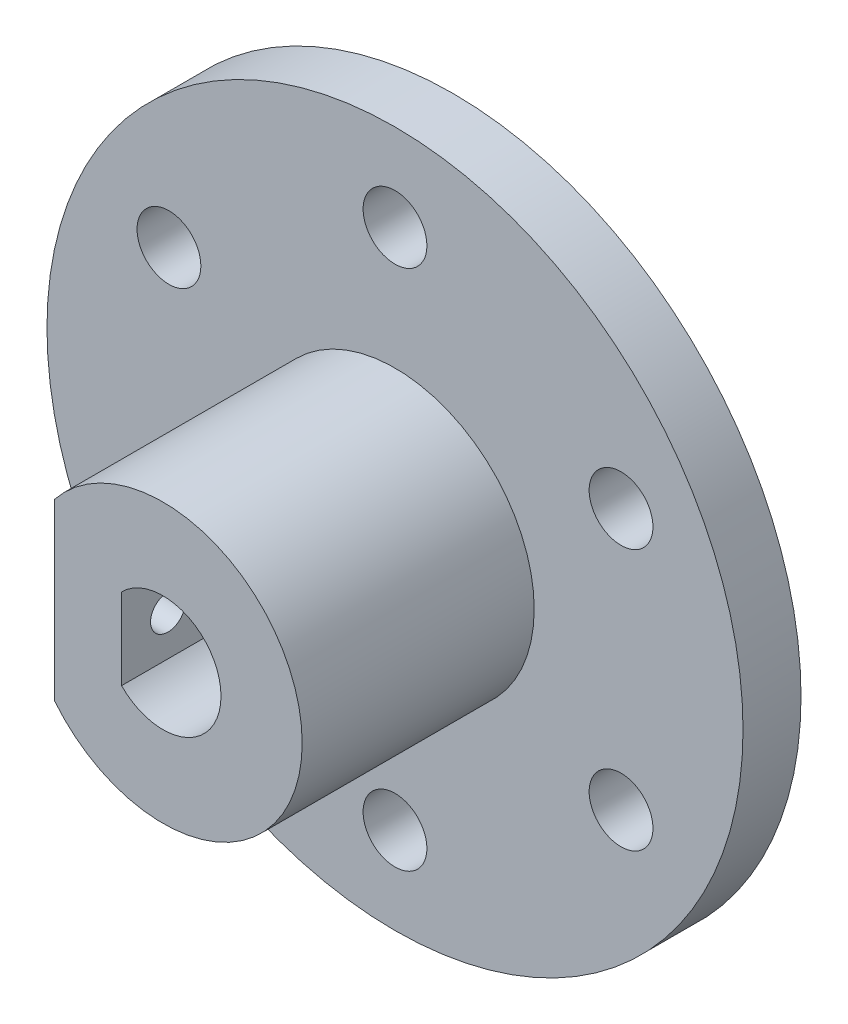
ISO-10303-21;
HEADER;
FILE_DESCRIPTION(('STEP AP214'),'2;1');
FILE_NAME('part.step','',(''),(''),'','','');
FILE_SCHEMA(('AUTOMOTIVE_DESIGN { 1 0 10303 214 1 1 1 1 }'));
ENDSEC;
DATA;
#1=APPLICATION_CONTEXT('core data for automotive mechanical design processes');
#2=APPLICATION_PROTOCOL_DEFINITION('international standard','automotive_design',2000,#1);
#3=PRODUCT_CONTEXT('',#1,'mechanical');
#4=PRODUCT('Part','Part','',(#3));
#5=PRODUCT_RELATED_PRODUCT_CATEGORY('part','',(#4));
#6=PRODUCT_DEFINITION_FORMATION('','',#4);
#7=PRODUCT_DEFINITION_CONTEXT('part definition',#1,'design');
#8=PRODUCT_DEFINITION('design','',#6,#7);
#9=PRODUCT_DEFINITION_SHAPE('','',#8);
#10=(LENGTH_UNIT() NAMED_UNIT(*) SI_UNIT(.MILLI.,.METRE.));
#11=(NAMED_UNIT(*) PLANE_ANGLE_UNIT() SI_UNIT($,.RADIAN.));
#12=(NAMED_UNIT(*) SI_UNIT($,.STERADIAN.) SOLID_ANGLE_UNIT());
#13=UNCERTAINTY_MEASURE_WITH_UNIT(LENGTH_MEASURE(1.E-05),#10,'distance_accuracy_value','');
#14=(GEOMETRIC_REPRESENTATION_CONTEXT(3) GLOBAL_UNCERTAINTY_ASSIGNED_CONTEXT((#13)) GLOBAL_UNIT_ASSIGNED_CONTEXT((#10,
#11,#12)) REPRESENTATION_CONTEXT('',''));
#15=CARTESIAN_POINT('',(0.,0.,0.));
#16=DIRECTION('',(0.,0.,1.));
#17=DIRECTION('',(1.,0.,0.));
#18=AXIS2_PLACEMENT_3D('',#15,#16,#17);
#19=CARTESIAN_POINT('',(0.,0.,5.));
#20=DIRECTION('',(0.,0.,1.));
#21=DIRECTION('',(1.,0.,0.));
#22=AXIS2_PLACEMENT_3D('',#19,#20,#21);
#23=PLANE('',#22);
#24=CARTESIAN_POINT('',(-19.4855715851499,11.25,5.));
#25=DIRECTION('',(0.,0.,1.));
#26=DIRECTION('',(1.,0.,0.));
#27=AXIS2_PLACEMENT_3D('',#24,#25,#26);
#28=CIRCLE('',#27,2.75);
#29=CARTESIAN_POINT('',(-16.7355715851499,11.25,5.));
#30=VERTEX_POINT('',#29);
#31=EDGE_CURVE('E118',#30,#30,#28,.T.);
#32=ORIENTED_EDGE('',*,*,#31,.F.);
#33=EDGE_LOOP('',(#32));
#34=FACE_BOUND('',#33,.T.);
#35=CARTESIAN_POINT('',(0.,-22.5,5.));
#36=DIRECTION('',(0.,0.,1.));
#37=DIRECTION('',(1.,0.,0.));
#38=AXIS2_PLACEMENT_3D('',#35,#36,#37);
#39=CIRCLE('',#38,2.75);
#40=CARTESIAN_POINT('',(2.75,-22.5,5.));
#41=VERTEX_POINT('',#40);
#42=EDGE_CURVE('E130',#41,#41,#39,.T.);
#43=ORIENTED_EDGE('',*,*,#42,.F.);
#44=EDGE_LOOP('',(#43));
#45=FACE_BOUND('',#44,.T.);
#46=CARTESIAN_POINT('',(19.4855715851499,11.25,5.));
#47=DIRECTION('',(0.,0.,1.));
#48=DIRECTION('',(1.,0.,0.));
#49=AXIS2_PLACEMENT_3D('',#46,#47,#48);
#50=CIRCLE('',#49,2.75);
#51=CARTESIAN_POINT('',(22.2355715851499,11.25,5.));
#52=VERTEX_POINT('',#51);
#53=EDGE_CURVE('E142',#52,#52,#50,.T.);
#54=ORIENTED_EDGE('',*,*,#53,.F.);
#55=EDGE_LOOP('',(#54));
#56=FACE_BOUND('',#55,.T.);
#57=CARTESIAN_POINT('',(0.,0.,5.));
#58=DIRECTION('',(0.,0.,1.));
#59=DIRECTION('',(1.,0.,0.));
#60=AXIS2_PLACEMENT_3D('',#57,#58,#59);
#61=CIRCLE('',#60,30.);
#62=CARTESIAN_POINT('',(30.,0.,5.));
#63=VERTEX_POINT('',#62);
#64=EDGE_CURVE('E11',#63,#63,#61,.T.);
#65=ORIENTED_EDGE('',*,*,#64,.T.);
#66=EDGE_LOOP('',(#65));
#67=FACE_BOUND('',#66,.T.);
#68=CARTESIAN_POINT('',(0.,22.5,5.));
#69=DIRECTION('',(0.,0.,1.));
#70=DIRECTION('',(1.,0.,0.));
#71=AXIS2_PLACEMENT_3D('',#68,#69,#70);
#72=CIRCLE('',#71,2.75);
#73=CARTESIAN_POINT('',(2.75,22.5,5.));
#74=VERTEX_POINT('',#73);
#75=EDGE_CURVE('E148',#74,#74,#72,.T.);
#76=ORIENTED_EDGE('',*,*,#75,.F.);
#77=EDGE_LOOP('',(#76));
#78=FACE_BOUND('',#77,.T.);
#79=CARTESIAN_POINT('',(19.4855715851499,-11.25,5.));
#80=DIRECTION('',(0.,0.,1.));
#81=DIRECTION('',(1.,0.,0.));
#82=AXIS2_PLACEMENT_3D('',#79,#80,#81);
#83=CIRCLE('',#82,2.75);
#84=CARTESIAN_POINT('',(22.2355715851499,-11.25,5.));
#85=VERTEX_POINT('',#84);
#86=EDGE_CURVE('E136',#85,#85,#83,.T.);
#87=ORIENTED_EDGE('',*,*,#86,.F.);
#88=EDGE_LOOP('',(#87));
#89=FACE_BOUND('',#88,.T.);
#90=CARTESIAN_POINT('',(-19.4855715851499,-11.25,5.));
#91=DIRECTION('',(0.,0.,1.));
#92=DIRECTION('',(1.,0.,0.));
#93=AXIS2_PLACEMENT_3D('',#90,#91,#92);
#94=CIRCLE('',#93,2.75);
#95=CARTESIAN_POINT('',(-16.7355715851499,-11.25,5.));
#96=VERTEX_POINT('',#95);
#97=EDGE_CURVE('E124',#96,#96,#94,.T.);
#98=ORIENTED_EDGE('',*,*,#97,.F.);
#99=EDGE_LOOP('',(#98));
#100=FACE_BOUND('',#99,.T.);
#101=DIRECTION('',(0.,-1.,0.));
#102=VECTOR('',#101,1.);
#103=CARTESIAN_POINT('',(-9.3674969975976,-7.5,5.));
#104=LINE('',#103,#102);
#105=CARTESIAN_POINT('',(-9.3674969975976,7.5,5.));
#106=VERTEX_POINT('',#105);
#107=CARTESIAN_POINT('',(-9.3674969975976,-7.5,5.));
#108=VERTEX_POINT('',#107);
#109=EDGE_CURVE('E109',#106,#108,#104,.T.);
#110=ORIENTED_EDGE('',*,*,#109,.F.);
#111=CARTESIAN_POINT('',(0.,0.,5.));
#112=DIRECTION('',(0.,0.,1.));
#113=DIRECTION('',(1.,0.,0.));
#114=AXIS2_PLACEMENT_3D('',#111,#112,#113);
#115=CIRCLE('',#114,12.);
#116=EDGE_CURVE('E52',#108,#106,#115,.T.);
#117=ORIENTED_EDGE('',*,*,#116,.F.);
#118=EDGE_LOOP('',(#110,#117));
#119=FACE_BOUND('',#118,.T.);
#120=ADVANCED_FACE('F35',(#34,#45,#56,#67,#78,#89,#100,#119),#23,.T.);
#121=CARTESIAN_POINT('',(0.,0.,0.));
#122=DIRECTION('',(0.,0.,1.));
#123=DIRECTION('',(1.,0.,0.));
#124=AXIS2_PLACEMENT_3D('',#121,#122,#123);
#125=PLANE('',#124);
#126=CARTESIAN_POINT('',(0.,0.,0.));
#127=DIRECTION('',(0.,0.,1.));
#128=DIRECTION('',(1.,0.,0.));
#129=AXIS2_PLACEMENT_3D('',#126,#127,#128);
#130=CIRCLE('',#129,30.);
#131=CARTESIAN_POINT('',(30.,0.,0.));
#132=VERTEX_POINT('',#131);
#133=EDGE_CURVE('E44',#132,#132,#130,.T.);
#134=ORIENTED_EDGE('',*,*,#133,.F.);
#135=EDGE_LOOP('',(#134));
#136=FACE_BOUND('',#135,.T.);
#137=CARTESIAN_POINT('',(0.,22.5,0.));
#138=DIRECTION('',(0.,0.,1.));
#139=DIRECTION('',(1.,0.,0.));
#140=AXIS2_PLACEMENT_3D('',#137,#138,#139);
#141=CIRCLE('',#140,2.75);
#142=CARTESIAN_POINT('',(2.75,22.5,0.));
#143=VERTEX_POINT('',#142);
#144=EDGE_CURVE('E145',#143,#143,#141,.T.);
#145=ORIENTED_EDGE('',*,*,#144,.T.);
#146=EDGE_LOOP('',(#145));
#147=FACE_BOUND('',#146,.T.);
#148=CARTESIAN_POINT('',(19.4855715851499,11.25,0.));
#149=DIRECTION('',(0.,0.,1.));
#150=DIRECTION('',(1.,0.,0.));
#151=AXIS2_PLACEMENT_3D('',#148,#149,#150);
#152=CIRCLE('',#151,2.75);
#153=CARTESIAN_POINT('',(22.2355715851499,11.25,0.));
#154=VERTEX_POINT('',#153);
#155=EDGE_CURVE('E139',#154,#154,#152,.T.);
#156=ORIENTED_EDGE('',*,*,#155,.T.);
#157=EDGE_LOOP('',(#156));
#158=FACE_BOUND('',#157,.T.);
#159=CARTESIAN_POINT('',(19.4855715851499,-11.25,0.));
#160=DIRECTION('',(0.,0.,1.));
#161=DIRECTION('',(1.,0.,0.));
#162=AXIS2_PLACEMENT_3D('',#159,#160,#161);
#163=CIRCLE('',#162,2.75);
#164=CARTESIAN_POINT('',(22.2355715851499,-11.25,0.));
#165=VERTEX_POINT('',#164);
#166=EDGE_CURVE('E133',#165,#165,#163,.T.);
#167=ORIENTED_EDGE('',*,*,#166,.T.);
#168=EDGE_LOOP('',(#167));
#169=FACE_BOUND('',#168,.T.);
#170=CARTESIAN_POINT('',(0.,-22.5,0.));
#171=DIRECTION('',(0.,0.,1.));
#172=DIRECTION('',(1.,0.,0.));
#173=AXIS2_PLACEMENT_3D('',#170,#171,#172);
#174=CIRCLE('',#173,2.75);
#175=CARTESIAN_POINT('',(2.75,-22.5,0.));
#176=VERTEX_POINT('',#175);
#177=EDGE_CURVE('E127',#176,#176,#174,.T.);
#178=ORIENTED_EDGE('',*,*,#177,.T.);
#179=EDGE_LOOP('',(#178));
#180=FACE_BOUND('',#179,.T.);
#181=CARTESIAN_POINT('',(-19.4855715851499,-11.25,0.));
#182=DIRECTION('',(0.,0.,1.));
#183=DIRECTION('',(1.,0.,0.));
#184=AXIS2_PLACEMENT_3D('',#181,#182,#183);
#185=CIRCLE('',#184,2.75);
#186=CARTESIAN_POINT('',(-16.7355715851499,-11.25,0.));
#187=VERTEX_POINT('',#186);
#188=EDGE_CURVE('E121',#187,#187,#185,.T.);
#189=ORIENTED_EDGE('',*,*,#188,.T.);
#190=EDGE_LOOP('',(#189));
#191=FACE_BOUND('',#190,.T.);
#192=CARTESIAN_POINT('',(-19.4855715851499,11.25,0.));
#193=DIRECTION('',(0.,0.,1.));
#194=DIRECTION('',(1.,0.,0.));
#195=AXIS2_PLACEMENT_3D('',#192,#193,#194);
#196=CIRCLE('',#195,2.75);
#197=CARTESIAN_POINT('',(-16.7355715851499,11.25,0.));
#198=VERTEX_POINT('',#197);
#199=EDGE_CURVE('E117',#198,#198,#196,.T.);
#200=ORIENTED_EDGE('',*,*,#199,.T.);
#201=EDGE_LOOP('',(#200));
#202=FACE_BOUND('',#201,.T.);
#203=ADVANCED_FACE('F180',(#136,#147,#158,#169,#180,#191,#202),#125,.F.);
#204=CARTESIAN_POINT('',(0.,0.,5.));
#205=DIRECTION('',(0.,0.,-1.));
#206=DIRECTION('',(-1.,0.,0.));
#207=AXIS2_PLACEMENT_3D('',#204,#205,#206);
#208=CYLINDRICAL_SURFACE('',#207,30.);
#209=ORIENTED_EDGE('',*,*,#64,.F.);
#210=EDGE_LOOP('',(#209));
#211=FACE_BOUND('',#210,.T.);
#212=ORIENTED_EDGE('',*,*,#133,.T.);
#213=EDGE_LOOP('',(#212));
#214=FACE_BOUND('',#213,.T.);
#215=ADVANCED_FACE('F37',(#211,#214),#208,.T.);
#216=CARTESIAN_POINT('',(0.,22.5,5.));
#217=DIRECTION('',(0.,0.,-1.));
#218=DIRECTION('',(-1.,0.,0.));
#219=AXIS2_PLACEMENT_3D('',#216,#217,#218);
#220=CYLINDRICAL_SURFACE('',#219,2.75);
#221=ORIENTED_EDGE('',*,*,#75,.T.);
#222=EDGE_LOOP('',(#221));
#223=FACE_BOUND('',#222,.T.);
#224=ORIENTED_EDGE('',*,*,#144,.F.);
#225=EDGE_LOOP('',(#224));
#226=FACE_BOUND('',#225,.T.);
#227=ADVANCED_FACE('F231',(#223,#226),#220,.F.);
#228=CARTESIAN_POINT('',(19.4855715851499,11.25,5.));
#229=DIRECTION('',(0.,0.,-1.));
#230=DIRECTION('',(-1.,0.,0.));
#231=AXIS2_PLACEMENT_3D('',#228,#229,#230);
#232=CYLINDRICAL_SURFACE('',#231,2.75);
#233=ORIENTED_EDGE('',*,*,#53,.T.);
#234=EDGE_LOOP('',(#233));
#235=FACE_BOUND('',#234,.T.);
#236=ORIENTED_EDGE('',*,*,#155,.F.);
#237=EDGE_LOOP('',(#236));
#238=FACE_BOUND('',#237,.T.);
#239=ADVANCED_FACE('F228',(#235,#238),#232,.F.);
#240=CARTESIAN_POINT('',(19.4855715851499,-11.25,5.));
#241=DIRECTION('',(0.,0.,-1.));
#242=DIRECTION('',(-1.,0.,0.));
#243=AXIS2_PLACEMENT_3D('',#240,#241,#242);
#244=CYLINDRICAL_SURFACE('',#243,2.75);
#245=ORIENTED_EDGE('',*,*,#86,.T.);
#246=EDGE_LOOP('',(#245));
#247=FACE_BOUND('',#246,.T.);
#248=ORIENTED_EDGE('',*,*,#166,.F.);
#249=EDGE_LOOP('',(#248));
#250=FACE_BOUND('',#249,.T.);
#251=ADVANCED_FACE('F224',(#247,#250),#244,.F.);
#252=CARTESIAN_POINT('',(0.,-22.5,5.));
#253=DIRECTION('',(0.,0.,-1.));
#254=DIRECTION('',(-1.,0.,0.));
#255=AXIS2_PLACEMENT_3D('',#252,#253,#254);
#256=CYLINDRICAL_SURFACE('',#255,2.75);
#257=ORIENTED_EDGE('',*,*,#42,.T.);
#258=EDGE_LOOP('',(#257));
#259=FACE_BOUND('',#258,.T.);
#260=ORIENTED_EDGE('',*,*,#177,.F.);
#261=EDGE_LOOP('',(#260));
#262=FACE_BOUND('',#261,.T.);
#263=ADVANCED_FACE('F220',(#259,#262),#256,.F.);
#264=CARTESIAN_POINT('',(-19.4855715851499,-11.25,5.));
#265=DIRECTION('',(0.,0.,-1.));
#266=DIRECTION('',(-1.,0.,0.));
#267=AXIS2_PLACEMENT_3D('',#264,#265,#266);
#268=CYLINDRICAL_SURFACE('',#267,2.75);
#269=ORIENTED_EDGE('',*,*,#97,.T.);
#270=EDGE_LOOP('',(#269));
#271=FACE_BOUND('',#270,.T.);
#272=ORIENTED_EDGE('',*,*,#188,.F.);
#273=EDGE_LOOP('',(#272));
#274=FACE_BOUND('',#273,.T.);
#275=ADVANCED_FACE('F216',(#271,#274),#268,.F.);
#276=CARTESIAN_POINT('',(-19.4855715851499,11.25,5.));
#277=DIRECTION('',(0.,0.,-1.));
#278=DIRECTION('',(-1.,0.,0.));
#279=AXIS2_PLACEMENT_3D('',#276,#277,#278);
#280=CYLINDRICAL_SURFACE('',#279,2.75);
#281=ORIENTED_EDGE('',*,*,#31,.T.);
#282=EDGE_LOOP('',(#281));
#283=FACE_BOUND('',#282,.T.);
#284=ORIENTED_EDGE('',*,*,#199,.F.);
#285=EDGE_LOOP('',(#284));
#286=FACE_BOUND('',#285,.T.);
#287=ADVANCED_FACE('F209',(#283,#286),#280,.F.);
#288=CARTESIAN_POINT('',(0.,0.,25.));
#289=DIRECTION('',(0.,0.,1.));
#290=DIRECTION('',(1.,0.,0.));
#291=AXIS2_PLACEMENT_3D('',#288,#289,#290);
#292=PLANE('',#291);
#293=CARTESIAN_POINT('',(0.,0.,25.));
#294=DIRECTION('',(0.,0.,1.));
#295=DIRECTION('',(1.,0.,0.));
#296=AXIS2_PLACEMENT_3D('',#293,#294,#295);
#297=CIRCLE('',#296,12.);
#298=CARTESIAN_POINT('',(-9.3674969975976,-7.5,25.));
#299=VERTEX_POINT('',#298);
#300=CARTESIAN_POINT('',(-9.3674969975976,7.5,25.));
#301=VERTEX_POINT('',#300);
#302=EDGE_CURVE('E105',#299,#301,#297,.T.);
#303=ORIENTED_EDGE('',*,*,#302,.T.);
#304=DIRECTION('',(0.,-1.,0.));
#305=VECTOR('',#304,1.);
#306=CARTESIAN_POINT('',(-9.3674969975976,-7.5,25.));
#307=LINE('',#306,#305);
#308=EDGE_CURVE('E108',#301,#299,#307,.T.);
#309=ORIENTED_EDGE('',*,*,#308,.T.);
#310=EDGE_LOOP('',(#303,#309));
#311=FACE_BOUND('',#310,.T.);
#312=DIRECTION('',(0.,-1.,0.));
#313=VECTOR('',#312,1.);
#314=CARTESIAN_POINT('',(-3.57071421427143,3.5,25.));
#315=LINE('',#314,#313);
#316=CARTESIAN_POINT('',(-3.57071421427143,3.5,25.));
#317=VERTEX_POINT('',#316);
#318=CARTESIAN_POINT('',(-3.57071421427143,-3.5,25.));
#319=VERTEX_POINT('',#318);
#320=EDGE_CURVE('E80',#317,#319,#315,.T.);
#321=ORIENTED_EDGE('',*,*,#320,.F.);
#322=CARTESIAN_POINT('',(0.,0.,25.));
#323=DIRECTION('',(0.,0.,1.));
#324=DIRECTION('',(1.,0.,0.));
#325=AXIS2_PLACEMENT_3D('',#322,#323,#324);
#326=CIRCLE('',#325,5.);
#327=EDGE_CURVE('E89',#319,#317,#326,.T.);
#328=ORIENTED_EDGE('',*,*,#327,.F.);
#329=EDGE_LOOP('',(#321,#328));
#330=FACE_BOUND('',#329,.T.);
#331=ADVANCED_FACE('F95',(#311,#330),#292,.T.);
#332=CARTESIAN_POINT('',(0.,0.,25.));
#333=DIRECTION('',(0.,0.,-1.));
#334=DIRECTION('',(-1.,0.,0.));
#335=AXIS2_PLACEMENT_3D('',#332,#333,#334);
#336=CYLINDRICAL_SURFACE('',#335,12.);
#337=ORIENTED_EDGE('',*,*,#116,.T.);
#338=DIRECTION('',(0.,0.,-1.));
#339=VECTOR('',#338,1.);
#340=CARTESIAN_POINT('',(-9.3674969975976,7.5,25.));
#341=LINE('',#340,#339);
#342=EDGE_CURVE('E115',#301,#106,#341,.T.);
#343=ORIENTED_EDGE('',*,*,#342,.F.);
#344=ORIENTED_EDGE('',*,*,#302,.F.);
#345=DIRECTION('',(0.,0.,-1.));
#346=VECTOR('',#345,1.);
#347=CARTESIAN_POINT('',(-9.3674969975976,-7.5,25.));
#348=LINE('',#347,#346);
#349=EDGE_CURVE('E111',#299,#108,#348,.T.);
#350=ORIENTED_EDGE('',*,*,#349,.T.);
#351=EDGE_LOOP('',(#337,#343,#344,#350));
#352=FACE_BOUND('',#351,.T.);
#353=ADVANCED_FACE('F172',(#352),#336,.T.);
#354=CARTESIAN_POINT('',(-9.3674969975976,-7.5,25.));
#355=DIRECTION('',(1.,0.,0.));
#356=DIRECTION('',(0.,0.,-1.));
#357=AXIS2_PLACEMENT_3D('',#354,#355,#356);
#358=PLANE('',#357);
#359=CARTESIAN_POINT('',(-9.3674969975976,0.,15.));
#360=DIRECTION('',(-1.,0.,0.));
#361=DIRECTION('',(0.,0.,1.));
#362=AXIS2_PLACEMENT_3D('',#359,#360,#361);
#363=CIRCLE('',#362,1.5);
#364=CARTESIAN_POINT('',(-9.3674969975976,0.,16.5));
#365=VERTEX_POINT('',#364);
#366=EDGE_CURVE('E161',#365,#365,#363,.T.);
#367=ORIENTED_EDGE('',*,*,#366,.F.);
#368=EDGE_LOOP('',(#367));
#369=FACE_BOUND('',#368,.T.);
#370=CARTESIAN_POINT('',(-9.3674969975976,0.,21.));
#371=DIRECTION('',(-1.,0.,0.));
#372=DIRECTION('',(0.,0.,1.));
#373=AXIS2_PLACEMENT_3D('',#370,#371,#372);
#374=CIRCLE('',#373,1.5);
#375=CARTESIAN_POINT('',(-9.3674969975976,0.,22.5));
#376=VERTEX_POINT('',#375);
#377=EDGE_CURVE('E99',#376,#376,#374,.T.);
#378=ORIENTED_EDGE('',*,*,#377,.F.);
#379=EDGE_LOOP('',(#378));
#380=FACE_BOUND('',#379,.T.);
#381=ORIENTED_EDGE('',*,*,#109,.T.);
#382=ORIENTED_EDGE('',*,*,#349,.F.);
#383=ORIENTED_EDGE('',*,*,#308,.F.);
#384=ORIENTED_EDGE('',*,*,#342,.T.);
#385=EDGE_LOOP('',(#381,#382,#383,#384));
#386=FACE_BOUND('',#385,.T.);
#387=ADVANCED_FACE('F169',(#369,#380,#386),#358,.F.);
#388=CARTESIAN_POINT('',(0.,0.,25.));
#389=DIRECTION('',(0.,0.,-1.));
#390=DIRECTION('',(-1.,0.,0.));
#391=AXIS2_PLACEMENT_3D('',#388,#389,#390);
#392=CYLINDRICAL_SURFACE('',#391,5.);
#393=CARTESIAN_POINT('',(0.,0.,5.));
#394=DIRECTION('',(0.,0.,1.));
#395=DIRECTION('',(1.,0.,0.));
#396=AXIS2_PLACEMENT_3D('',#393,#394,#395);
#397=CIRCLE('',#396,5.);
#398=CARTESIAN_POINT('',(-3.57071421427143,-3.5,5.));
#399=VERTEX_POINT('',#398);
#400=CARTESIAN_POINT('',(-3.57071421427143,3.5,5.));
#401=VERTEX_POINT('',#400);
#402=EDGE_CURVE('E93',#399,#401,#397,.T.);
#403=ORIENTED_EDGE('',*,*,#402,.F.);
#404=DIRECTION('',(0.,0.,-1.));
#405=VECTOR('',#404,1.);
#406=CARTESIAN_POINT('',(-3.57071421427143,-3.5,25.));
#407=LINE('',#406,#405);
#408=EDGE_CURVE('E83',#319,#399,#407,.T.);
#409=ORIENTED_EDGE('',*,*,#408,.F.);
#410=ORIENTED_EDGE('',*,*,#327,.T.);
#411=DIRECTION('',(0.,0.,-1.));
#412=VECTOR('',#411,1.);
#413=CARTESIAN_POINT('',(-3.57071421427143,3.5,25.));
#414=LINE('',#413,#412);
#415=EDGE_CURVE('E85',#317,#401,#414,.T.);
#416=ORIENTED_EDGE('',*,*,#415,.T.);
#417=EDGE_LOOP('',(#403,#409,#410,#416));
#418=FACE_BOUND('',#417,.T.);
#419=ADVANCED_FACE('F92',(#418),#392,.F.);
#420=CARTESIAN_POINT('',(-3.57071421427143,3.5,25.));
#421=DIRECTION('',(1.,0.,0.));
#422=DIRECTION('',(0.,0.,-1.));
#423=AXIS2_PLACEMENT_3D('',#420,#421,#422);
#424=PLANE('',#423);
#425=CARTESIAN_POINT('',(-3.57071421427143,0.,15.));
#426=DIRECTION('',(1.,0.,0.));
#427=DIRECTION('',(0.,0.,-1.));
#428=AXIS2_PLACEMENT_3D('',#425,#426,#427);
#429=CIRCLE('',#428,1.5);
#430=CARTESIAN_POINT('',(-3.57071421427143,0.,13.5));
#431=VERTEX_POINT('',#430);
#432=EDGE_CURVE('E39',#431,#431,#429,.T.);
#433=ORIENTED_EDGE('',*,*,#432,.F.);
#434=EDGE_LOOP('',(#433));
#435=FACE_BOUND('',#434,.T.);
#436=CARTESIAN_POINT('',(-3.57071421427143,0.,21.));
#437=DIRECTION('',(1.,0.,0.));
#438=DIRECTION('',(0.,0.,-1.));
#439=AXIS2_PLACEMENT_3D('',#436,#437,#438);
#440=CIRCLE('',#439,1.5);
#441=CARTESIAN_POINT('',(-3.57071421427143,0.,19.5));
#442=VERTEX_POINT('',#441);
#443=EDGE_CURVE('E102',#442,#442,#440,.T.);
#444=ORIENTED_EDGE('',*,*,#443,.F.);
#445=EDGE_LOOP('',(#444));
#446=FACE_BOUND('',#445,.T.);
#447=DIRECTION('',(0.,-1.,0.));
#448=VECTOR('',#447,1.);
#449=CARTESIAN_POINT('',(-3.57071421427143,3.5,5.));
#450=LINE('',#449,#448);
#451=EDGE_CURVE('E59',#401,#399,#450,.T.);
#452=ORIENTED_EDGE('',*,*,#451,.F.);
#453=ORIENTED_EDGE('',*,*,#415,.F.);
#454=ORIENTED_EDGE('',*,*,#320,.T.);
#455=ORIENTED_EDGE('',*,*,#408,.T.);
#456=EDGE_LOOP('',(#452,#453,#454,#455));
#457=FACE_BOUND('',#456,.T.);
#458=ADVANCED_FACE('F82',(#435,#446,#457),#424,.T.);
#459=ORIENTED_EDGE('',*,*,#402,.T.);
#460=ORIENTED_EDGE('',*,*,#451,.T.);
#461=EDGE_LOOP('',(#459,#460));
#462=FACE_BOUND('',#461,.T.);
#463=ADVANCED_FACE('F183',(#462),#23,.T.);
#464=CARTESIAN_POINT('',(0.632503002402402,0.,21.));
#465=DIRECTION('',(-1.,0.,0.));
#466=DIRECTION('',(0.,0.,1.));
#467=AXIS2_PLACEMENT_3D('',#464,#465,#466);
#468=CYLINDRICAL_SURFACE('',#467,1.5);
#469=ORIENTED_EDGE('',*,*,#443,.T.);
#470=EDGE_LOOP('',(#469));
#471=FACE_BOUND('',#470,.T.);
#472=ORIENTED_EDGE('',*,*,#377,.T.);
#473=EDGE_LOOP('',(#472));
#474=FACE_BOUND('',#473,.T.);
#475=ADVANCED_FACE('F192',(#471,#474),#468,.F.);
#476=CARTESIAN_POINT('',(0.632503002402402,0.,15.));
#477=DIRECTION('',(-1.,0.,0.));
#478=DIRECTION('',(0.,0.,1.));
#479=AXIS2_PLACEMENT_3D('',#476,#477,#478);
#480=CYLINDRICAL_SURFACE('',#479,1.5);
#481=ORIENTED_EDGE('',*,*,#432,.T.);
#482=EDGE_LOOP('',(#481));
#483=FACE_BOUND('',#482,.T.);
#484=ORIENTED_EDGE('',*,*,#366,.T.);
#485=EDGE_LOOP('',(#484));
#486=FACE_BOUND('',#485,.T.);
#487=ADVANCED_FACE('F167',(#483,#486),#480,.F.);
#488=CLOSED_SHELL('',(#120,#203,#215,#227,#239,#251,#263,#275,#287,#331,#353,#387,#419,#458,
#463,#475,#487));
#489=MANIFOLD_SOLID_BREP('B2',#488);
#490=ADVANCED_BREP_SHAPE_REPRESENTATION('',(#18,#489),#14);
#491=SHAPE_DEFINITION_REPRESENTATION(#9,#490);
ENDSEC;
END-ISO-10303-21;
